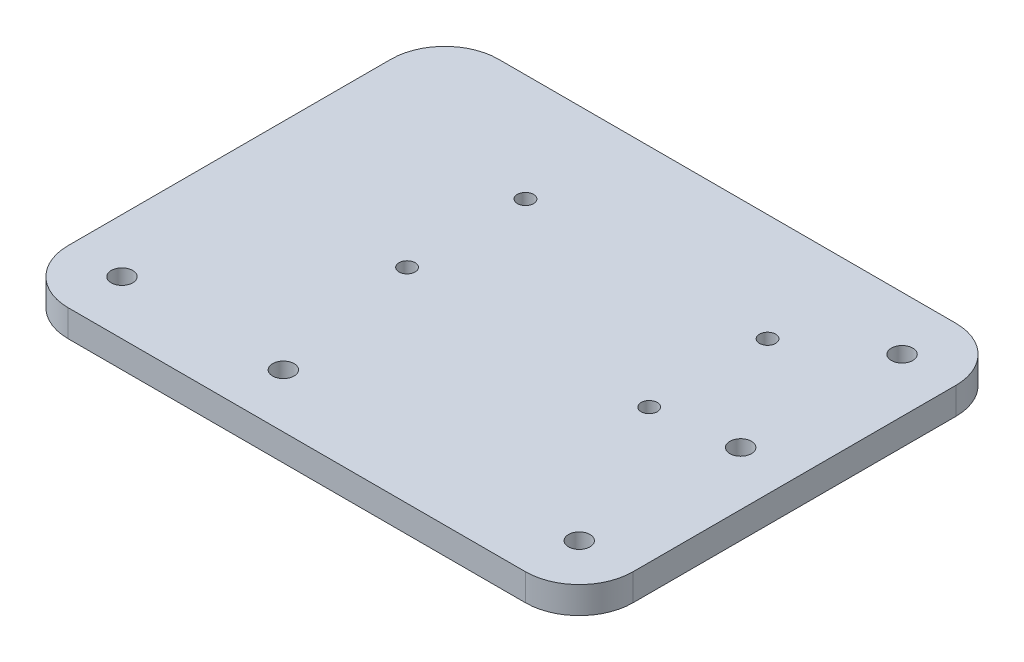
ISO-10303-21;
HEADER;
FILE_DESCRIPTION(('STEP AP214'),'2;1');
FILE_NAME('part.step','',(''),(''),'','','');
FILE_SCHEMA(('AUTOMOTIVE_DESIGN { 1 0 10303 214 1 1 1 1 }'));
ENDSEC;
DATA;
#1=APPLICATION_CONTEXT('core data for automotive mechanical design processes');
#2=APPLICATION_PROTOCOL_DEFINITION('international standard','automotive_design',2000,#1);
#3=PRODUCT_CONTEXT('',#1,'mechanical');
#4=PRODUCT('Part','Part','',(#3));
#5=PRODUCT_RELATED_PRODUCT_CATEGORY('part','',(#4));
#6=PRODUCT_DEFINITION_FORMATION('','',#4);
#7=PRODUCT_DEFINITION_CONTEXT('part definition',#1,'design');
#8=PRODUCT_DEFINITION('design','',#6,#7);
#9=PRODUCT_DEFINITION_SHAPE('','',#8);
#10=(LENGTH_UNIT() NAMED_UNIT(*) SI_UNIT(.MILLI.,.METRE.));
#11=(NAMED_UNIT(*) PLANE_ANGLE_UNIT() SI_UNIT($,.RADIAN.));
#12=(NAMED_UNIT(*) SI_UNIT($,.STERADIAN.) SOLID_ANGLE_UNIT());
#13=UNCERTAINTY_MEASURE_WITH_UNIT(LENGTH_MEASURE(1.E-05),#10,'distance_accuracy_value','');
#14=(GEOMETRIC_REPRESENTATION_CONTEXT(3) GLOBAL_UNCERTAINTY_ASSIGNED_CONTEXT((#13)) GLOBAL_UNIT_ASSIGNED_CONTEXT((#10,
#11,#12)) REPRESENTATION_CONTEXT('',''));
#15=CARTESIAN_POINT('',(0.,0.,0.));
#16=DIRECTION('',(0.,0.,1.));
#17=DIRECTION('',(1.,0.,0.));
#18=AXIS2_PLACEMENT_3D('',#15,#16,#17);
#19=CARTESIAN_POINT('',(-52.5,5.,40.));
#20=DIRECTION('',(1.,0.,0.));
#21=DIRECTION('',(0.,0.,-1.));
#22=AXIS2_PLACEMENT_3D('',#19,#20,#21);
#23=PLANE('',#22);
#24=DIRECTION('',(0.,0.,1.));
#25=VECTOR('',#24,1.);
#26=CARTESIAN_POINT('',(-52.5,0.,40.));
#27=LINE('',#26,#25);
#28=CARTESIAN_POINT('',(-52.5,0.,-30.));
#29=VERTEX_POINT('',#28);
#30=CARTESIAN_POINT('',(-52.5,0.,30.));
#31=VERTEX_POINT('',#30);
#32=EDGE_CURVE('E136',#29,#31,#27,.T.);
#33=ORIENTED_EDGE('',*,*,#32,.T.);
#34=DIRECTION('',(0.,-1.,0.));
#35=VECTOR('',#34,1.);
#36=CARTESIAN_POINT('',(-52.5,5.,30.));
#37=LINE('',#36,#35);
#38=CARTESIAN_POINT('',(-52.5,5.,30.));
#39=VERTEX_POINT('',#38);
#40=EDGE_CURVE('E111',#31,#39,#37,.F.);
#41=ORIENTED_EDGE('',*,*,#40,.T.);
#42=DIRECTION('',(0.,0.,1.));
#43=VECTOR('',#42,1.);
#44=CARTESIAN_POINT('',(-52.5,5.,40.));
#45=LINE('',#44,#43);
#46=CARTESIAN_POINT('',(-52.5,5.,-30.));
#47=VERTEX_POINT('',#46);
#48=EDGE_CURVE('E149',#47,#39,#45,.T.);
#49=ORIENTED_EDGE('',*,*,#48,.F.);
#50=DIRECTION('',(0.,-1.,0.));
#51=VECTOR('',#50,1.);
#52=CARTESIAN_POINT('',(-52.5,5.,-30.));
#53=LINE('',#52,#51);
#54=EDGE_CURVE('E117',#47,#29,#53,.T.);
#55=ORIENTED_EDGE('',*,*,#54,.T.);
#56=EDGE_LOOP('',(#33,#41,#49,#55));
#57=FACE_BOUND('',#56,.T.);
#58=ADVANCED_FACE('F39',(#57),#23,.F.);
#59=CARTESIAN_POINT('',(52.5,5.,40.));
#60=DIRECTION('',(0.,0.,-1.));
#61=DIRECTION('',(-1.,0.,0.));
#62=AXIS2_PLACEMENT_3D('',#59,#60,#61);
#63=PLANE('',#62);
#64=DIRECTION('',(1.,0.,0.));
#65=VECTOR('',#64,1.);
#66=CARTESIAN_POINT('',(52.5,5.,40.));
#67=LINE('',#66,#65);
#68=CARTESIAN_POINT('',(-42.5,5.,40.));
#69=VERTEX_POINT('',#68);
#70=CARTESIAN_POINT('',(42.5,5.,40.));
#71=VERTEX_POINT('',#70);
#72=EDGE_CURVE('E127',#69,#71,#67,.T.);
#73=ORIENTED_EDGE('',*,*,#72,.F.);
#74=DIRECTION('',(0.,-1.,0.));
#75=VECTOR('',#74,1.);
#76=CARTESIAN_POINT('',(-42.5,5.,40.));
#77=LINE('',#76,#75);
#78=CARTESIAN_POINT('',(-42.5,0.,40.));
#79=VERTEX_POINT('',#78);
#80=EDGE_CURVE('E110',#69,#79,#77,.T.);
#81=ORIENTED_EDGE('',*,*,#80,.T.);
#82=DIRECTION('',(1.,0.,0.));
#83=VECTOR('',#82,1.);
#84=CARTESIAN_POINT('',(52.5,0.,40.));
#85=LINE('',#84,#83);
#86=CARTESIAN_POINT('',(42.5,0.,40.));
#87=VERTEX_POINT('',#86);
#88=EDGE_CURVE('E124',#79,#87,#85,.T.);
#89=ORIENTED_EDGE('',*,*,#88,.T.);
#90=DIRECTION('',(0.,-1.,0.));
#91=VECTOR('',#90,1.);
#92=CARTESIAN_POINT('',(42.5,5.,40.));
#93=LINE('',#92,#91);
#94=EDGE_CURVE('E130',#87,#71,#93,.F.);
#95=ORIENTED_EDGE('',*,*,#94,.T.);
#96=EDGE_LOOP('',(#73,#81,#89,#95));
#97=FACE_BOUND('',#96,.T.);
#98=ADVANCED_FACE('F123',(#97),#63,.F.);
#99=CARTESIAN_POINT('',(52.5,5.,40.));
#100=DIRECTION('',(-1.,0.,0.));
#101=DIRECTION('',(0.,0.,1.));
#102=AXIS2_PLACEMENT_3D('',#99,#100,#101);
#103=PLANE('',#102);
#104=DIRECTION('',(0.,0.,-1.));
#105=VECTOR('',#104,1.);
#106=CARTESIAN_POINT('',(52.5,0.,40.));
#107=LINE('',#106,#105);
#108=CARTESIAN_POINT('',(52.5,0.,30.));
#109=VERTEX_POINT('',#108);
#110=CARTESIAN_POINT('',(52.5,0.,-30.));
#111=VERTEX_POINT('',#110);
#112=EDGE_CURVE('E135',#109,#111,#107,.T.);
#113=ORIENTED_EDGE('',*,*,#112,.T.);
#114=DIRECTION('',(0.,-1.,0.));
#115=VECTOR('',#114,1.);
#116=CARTESIAN_POINT('',(52.5,5.,-30.));
#117=LINE('',#116,#115);
#118=CARTESIAN_POINT('',(52.5,5.,-30.));
#119=VERTEX_POINT('',#118);
#120=EDGE_CURVE('E11',#111,#119,#117,.F.);
#121=ORIENTED_EDGE('',*,*,#120,.T.);
#122=DIRECTION('',(0.,0.,-1.));
#123=VECTOR('',#122,1.);
#124=CARTESIAN_POINT('',(52.5,5.,40.));
#125=LINE('',#124,#123);
#126=CARTESIAN_POINT('',(52.5,5.,30.));
#127=VERTEX_POINT('',#126);
#128=EDGE_CURVE('E188',#127,#119,#125,.T.);
#129=ORIENTED_EDGE('',*,*,#128,.F.);
#130=DIRECTION('',(0.,-1.,0.));
#131=VECTOR('',#130,1.);
#132=CARTESIAN_POINT('',(52.5,5.,30.));
#133=LINE('',#132,#131);
#134=EDGE_CURVE('E48',#127,#109,#133,.T.);
#135=ORIENTED_EDGE('',*,*,#134,.T.);
#136=EDGE_LOOP('',(#113,#121,#129,#135));
#137=FACE_BOUND('',#136,.T.);
#138=ADVANCED_FACE('F186',(#137),#103,.F.);
#139=CARTESIAN_POINT('',(52.5,5.,-40.));
#140=DIRECTION('',(0.,0.,1.));
#141=DIRECTION('',(1.,0.,0.));
#142=AXIS2_PLACEMENT_3D('',#139,#140,#141);
#143=PLANE('',#142);
#144=DIRECTION('',(-1.,0.,0.));
#145=VECTOR('',#144,1.);
#146=CARTESIAN_POINT('',(52.5,0.,-40.));
#147=LINE('',#146,#145);
#148=CARTESIAN_POINT('',(42.5,0.,-40.));
#149=VERTEX_POINT('',#148);
#150=CARTESIAN_POINT('',(-42.5,0.,-40.));
#151=VERTEX_POINT('',#150);
#152=EDGE_CURVE('E141',#149,#151,#147,.T.);
#153=ORIENTED_EDGE('',*,*,#152,.T.);
#154=DIRECTION('',(0.,-1.,0.));
#155=VECTOR('',#154,1.);
#156=CARTESIAN_POINT('',(-42.5,5.,-40.));
#157=LINE('',#156,#155);
#158=CARTESIAN_POINT('',(-42.5,5.,-40.));
#159=VERTEX_POINT('',#158);
#160=EDGE_CURVE('E55',#151,#159,#157,.F.);
#161=ORIENTED_EDGE('',*,*,#160,.T.);
#162=DIRECTION('',(-1.,0.,0.));
#163=VECTOR('',#162,1.);
#164=CARTESIAN_POINT('',(52.5,5.,-40.));
#165=LINE('',#164,#163);
#166=CARTESIAN_POINT('',(42.5,5.,-40.));
#167=VERTEX_POINT('',#166);
#168=EDGE_CURVE('E151',#167,#159,#165,.T.);
#169=ORIENTED_EDGE('',*,*,#168,.F.);
#170=DIRECTION('',(0.,-1.,0.));
#171=VECTOR('',#170,1.);
#172=CARTESIAN_POINT('',(42.5,5.,-40.));
#173=LINE('',#172,#171);
#174=EDGE_CURVE('E176',#167,#149,#173,.T.);
#175=ORIENTED_EDGE('',*,*,#174,.T.);
#176=EDGE_LOOP('',(#153,#161,#169,#175));
#177=FACE_BOUND('',#176,.T.);
#178=ADVANCED_FACE('F195',(#177),#143,.F.);
#179=CARTESIAN_POINT('',(0.,5.,0.));
#180=DIRECTION('',(0.,1.,0.));
#181=DIRECTION('',(0.,0.,1.));
#182=AXIS2_PLACEMENT_3D('',#179,#180,#181);
#183=PLANE('',#182);
#184=CARTESIAN_POINT('',(42.5,5.,30.));
#185=DIRECTION('',(0.,1.,0.));
#186=DIRECTION('',(0.,0.,1.));
#187=AXIS2_PLACEMENT_3D('',#184,#185,#186);
#188=CIRCLE('',#187,2.);
#189=CARTESIAN_POINT('',(42.5,5.,32.));
#190=VERTEX_POINT('',#189);
#191=EDGE_CURVE('E262',#190,#190,#188,.T.);
#192=ORIENTED_EDGE('',*,*,#191,.F.);
#193=EDGE_LOOP('',(#192));
#194=FACE_BOUND('',#193,.T.);
#195=CARTESIAN_POINT('',(42.5,5.,-30.));
#196=DIRECTION('',(0.,1.,0.));
#197=DIRECTION('',(0.,0.,1.));
#198=AXIS2_PLACEMENT_3D('',#195,#196,#197);
#199=CIRCLE('',#198,2.);
#200=CARTESIAN_POINT('',(42.5,5.,-28.));
#201=VERTEX_POINT('',#200);
#202=EDGE_CURVE('E270',#201,#201,#199,.T.);
#203=ORIENTED_EDGE('',*,*,#202,.F.);
#204=EDGE_LOOP('',(#203));
#205=FACE_BOUND('',#204,.T.);
#206=CARTESIAN_POINT('',(42.5,5.,0.));
#207=DIRECTION('',(0.,1.,0.));
#208=DIRECTION('',(0.,0.,1.));
#209=AXIS2_PLACEMENT_3D('',#206,#207,#208);
#210=CIRCLE('',#209,2.);
#211=CARTESIAN_POINT('',(42.5,5.,2.00000000000002));
#212=VERTEX_POINT('',#211);
#213=EDGE_CURVE('E246',#212,#212,#210,.T.);
#214=ORIENTED_EDGE('',*,*,#213,.F.);
#215=EDGE_LOOP('',(#214));
#216=FACE_BOUND('',#215,.T.);
#217=CARTESIAN_POINT('',(-42.5,5.,30.));
#218=DIRECTION('',(0.,1.,0.));
#219=DIRECTION('',(0.,0.,1.));
#220=AXIS2_PLACEMENT_3D('',#217,#218,#219);
#221=CIRCLE('',#220,2.);
#222=CARTESIAN_POINT('',(-42.5,5.,32.));
#223=VERTEX_POINT('',#222);
#224=EDGE_CURVE('E255',#223,#223,#221,.T.);
#225=ORIENTED_EDGE('',*,*,#224,.F.);
#226=EDGE_LOOP('',(#225));
#227=FACE_BOUND('',#226,.T.);
#228=CARTESIAN_POINT('',(-12.5,5.,30.));
#229=DIRECTION('',(0.,1.,0.));
#230=DIRECTION('',(0.,0.,1.));
#231=AXIS2_PLACEMENT_3D('',#228,#229,#230);
#232=CIRCLE('',#231,2.);
#233=CARTESIAN_POINT('',(-12.5,5.,32.));
#234=VERTEX_POINT('',#233);
#235=EDGE_CURVE('E238',#234,#234,#232,.T.);
#236=ORIENTED_EDGE('',*,*,#235,.F.);
#237=EDGE_LOOP('',(#236));
#238=FACE_BOUND('',#237,.T.);
#239=CARTESIAN_POINT('',(27.5,5.,-20.));
#240=DIRECTION('',(0.,1.,0.));
#241=DIRECTION('',(0.,0.,1.));
#242=AXIS2_PLACEMENT_3D('',#239,#240,#241);
#243=CIRCLE('',#242,1.5);
#244=CARTESIAN_POINT('',(27.5,5.,-18.5));
#245=VERTEX_POINT('',#244);
#246=EDGE_CURVE('E231',#245,#245,#243,.T.);
#247=ORIENTED_EDGE('',*,*,#246,.F.);
#248=EDGE_LOOP('',(#247));
#249=FACE_BOUND('',#248,.T.);
#250=CARTESIAN_POINT('',(27.5,5.,2.00000000000002));
#251=DIRECTION('',(0.,1.,0.));
#252=DIRECTION('',(0.,0.,1.));
#253=AXIS2_PLACEMENT_3D('',#250,#251,#252);
#254=CIRCLE('',#253,1.5);
#255=CARTESIAN_POINT('',(27.5,5.,3.50000000000003));
#256=VERTEX_POINT('',#255);
#257=EDGE_CURVE('E223',#256,#256,#254,.T.);
#258=ORIENTED_EDGE('',*,*,#257,.F.);
#259=EDGE_LOOP('',(#258));
#260=FACE_BOUND('',#259,.T.);
#261=CARTESIAN_POINT('',(-17.5,5.,2.00000000000002));
#262=DIRECTION('',(0.,1.,0.));
#263=DIRECTION('',(0.,0.,1.));
#264=AXIS2_PLACEMENT_3D('',#261,#262,#263);
#265=CIRCLE('',#264,1.5);
#266=CARTESIAN_POINT('',(-17.5,5.,3.50000000000002));
#267=VERTEX_POINT('',#266);
#268=EDGE_CURVE('E214',#267,#267,#265,.T.);
#269=ORIENTED_EDGE('',*,*,#268,.F.);
#270=EDGE_LOOP('',(#269));
#271=FACE_BOUND('',#270,.T.);
#272=CARTESIAN_POINT('',(-17.5,5.,-20.));
#273=DIRECTION('',(0.,1.,0.));
#274=DIRECTION('',(0.,0.,1.));
#275=AXIS2_PLACEMENT_3D('',#272,#273,#274);
#276=CIRCLE('',#275,1.5);
#277=CARTESIAN_POINT('',(-17.5,5.,-18.5));
#278=VERTEX_POINT('',#277);
#279=EDGE_CURVE('E206',#278,#278,#276,.T.);
#280=ORIENTED_EDGE('',*,*,#279,.F.);
#281=EDGE_LOOP('',(#280));
#282=FACE_BOUND('',#281,.T.);
#283=ORIENTED_EDGE('',*,*,#48,.T.);
#284=CARTESIAN_POINT('',(-42.5,5.,30.));
#285=DIRECTION('',(0.,1.,0.));
#286=DIRECTION('',(0.,0.,1.));
#287=AXIS2_PLACEMENT_3D('',#284,#285,#286);
#288=CIRCLE('',#287,10.);
#289=EDGE_CURVE('E173',#39,#69,#288,.T.);
#290=ORIENTED_EDGE('',*,*,#289,.T.);
#291=ORIENTED_EDGE('',*,*,#72,.T.);
#292=CARTESIAN_POINT('',(42.5,5.,30.));
#293=DIRECTION('',(0.,1.,0.));
#294=DIRECTION('',(0.,0.,1.));
#295=AXIS2_PLACEMENT_3D('',#292,#293,#294);
#296=CIRCLE('',#295,10.);
#297=EDGE_CURVE('E165',#71,#127,#296,.T.);
#298=ORIENTED_EDGE('',*,*,#297,.T.);
#299=ORIENTED_EDGE('',*,*,#128,.T.);
#300=CARTESIAN_POINT('',(42.5,5.,-30.));
#301=DIRECTION('',(0.,1.,0.));
#302=DIRECTION('',(0.,0.,1.));
#303=AXIS2_PLACEMENT_3D('',#300,#301,#302);
#304=CIRCLE('',#303,10.);
#305=EDGE_CURVE('E62',#119,#167,#304,.T.);
#306=ORIENTED_EDGE('',*,*,#305,.T.);
#307=ORIENTED_EDGE('',*,*,#168,.T.);
#308=CARTESIAN_POINT('',(-42.5,5.,-30.));
#309=DIRECTION('',(0.,1.,0.));
#310=DIRECTION('',(0.,0.,1.));
#311=AXIS2_PLACEMENT_3D('',#308,#309,#310);
#312=CIRCLE('',#311,10.);
#313=EDGE_CURVE('E170',#159,#47,#312,.T.);
#314=ORIENTED_EDGE('',*,*,#313,.T.);
#315=EDGE_LOOP('',(#283,#290,#291,#298,#299,#306,#307,#314));
#316=FACE_BOUND('',#315,.T.);
#317=ADVANCED_FACE('F288',(#194,#205,#216,#227,#238,#249,#260,#271,#282,#316),#183,.T.);
#318=CARTESIAN_POINT('',(0.,0.,0.));
#319=DIRECTION('',(0.,1.,0.));
#320=DIRECTION('',(0.,0.,1.));
#321=AXIS2_PLACEMENT_3D('',#318,#319,#320);
#322=PLANE('',#321);
#323=CARTESIAN_POINT('',(42.5,0.,30.));
#324=DIRECTION('',(0.,1.,0.));
#325=DIRECTION('',(0.,0.,1.));
#326=AXIS2_PLACEMENT_3D('',#323,#324,#325);
#327=CIRCLE('',#326,2.);
#328=CARTESIAN_POINT('',(42.5,0.,32.));
#329=VERTEX_POINT('',#328);
#330=EDGE_CURVE('E266',#329,#329,#327,.T.);
#331=ORIENTED_EDGE('',*,*,#330,.T.);
#332=EDGE_LOOP('',(#331));
#333=FACE_BOUND('',#332,.T.);
#334=CARTESIAN_POINT('',(42.5,0.,-30.));
#335=DIRECTION('',(0.,1.,0.));
#336=DIRECTION('',(0.,0.,1.));
#337=AXIS2_PLACEMENT_3D('',#334,#335,#336);
#338=CIRCLE('',#337,2.);
#339=CARTESIAN_POINT('',(42.5,0.,-28.));
#340=VERTEX_POINT('',#339);
#341=EDGE_CURVE('E251',#340,#340,#338,.T.);
#342=ORIENTED_EDGE('',*,*,#341,.T.);
#343=EDGE_LOOP('',(#342));
#344=FACE_BOUND('',#343,.T.);
#345=CARTESIAN_POINT('',(42.5,0.,0.));
#346=DIRECTION('',(0.,1.,0.));
#347=DIRECTION('',(0.,0.,1.));
#348=AXIS2_PLACEMENT_3D('',#345,#346,#347);
#349=CIRCLE('',#348,2.);
#350=CARTESIAN_POINT('',(42.5,0.,2.00000000000002));
#351=VERTEX_POINT('',#350);
#352=EDGE_CURVE('E250',#351,#351,#349,.T.);
#353=ORIENTED_EDGE('',*,*,#352,.T.);
#354=EDGE_LOOP('',(#353));
#355=FACE_BOUND('',#354,.T.);
#356=CARTESIAN_POINT('',(-42.5,0.,30.));
#357=DIRECTION('',(0.,1.,0.));
#358=DIRECTION('',(0.,0.,1.));
#359=AXIS2_PLACEMENT_3D('',#356,#357,#358);
#360=CIRCLE('',#359,2.);
#361=CARTESIAN_POINT('',(-42.5,0.,32.));
#362=VERTEX_POINT('',#361);
#363=EDGE_CURVE('E242',#362,#362,#360,.T.);
#364=ORIENTED_EDGE('',*,*,#363,.T.);
#365=EDGE_LOOP('',(#364));
#366=FACE_BOUND('',#365,.T.);
#367=CARTESIAN_POINT('',(-12.5,0.,30.));
#368=DIRECTION('',(0.,1.,0.));
#369=DIRECTION('',(0.,0.,1.));
#370=AXIS2_PLACEMENT_3D('',#367,#368,#369);
#371=CIRCLE('',#370,2.);
#372=CARTESIAN_POINT('',(-12.5,0.,32.));
#373=VERTEX_POINT('',#372);
#374=EDGE_CURVE('E219',#373,#373,#371,.T.);
#375=ORIENTED_EDGE('',*,*,#374,.T.);
#376=EDGE_LOOP('',(#375));
#377=FACE_BOUND('',#376,.T.);
#378=CARTESIAN_POINT('',(27.5,0.,-20.));
#379=DIRECTION('',(0.,1.,0.));
#380=DIRECTION('',(0.,0.,1.));
#381=AXIS2_PLACEMENT_3D('',#378,#379,#380);
#382=CIRCLE('',#381,1.5);
#383=CARTESIAN_POINT('',(27.5,0.,-18.5));
#384=VERTEX_POINT('',#383);
#385=EDGE_CURVE('E210',#384,#384,#382,.T.);
#386=ORIENTED_EDGE('',*,*,#385,.T.);
#387=EDGE_LOOP('',(#386));
#388=FACE_BOUND('',#387,.T.);
#389=CARTESIAN_POINT('',(27.5,0.,2.00000000000002));
#390=DIRECTION('',(0.,1.,0.));
#391=DIRECTION('',(0.,0.,1.));
#392=AXIS2_PLACEMENT_3D('',#389,#390,#391);
#393=CIRCLE('',#392,1.5);
#394=CARTESIAN_POINT('',(27.5,0.,3.50000000000003));
#395=VERTEX_POINT('',#394);
#396=EDGE_CURVE('E227',#395,#395,#393,.T.);
#397=ORIENTED_EDGE('',*,*,#396,.T.);
#398=EDGE_LOOP('',(#397));
#399=FACE_BOUND('',#398,.T.);
#400=CARTESIAN_POINT('',(-17.5,0.,2.00000000000002));
#401=DIRECTION('',(0.,1.,0.));
#402=DIRECTION('',(0.,0.,1.));
#403=AXIS2_PLACEMENT_3D('',#400,#401,#402);
#404=CIRCLE('',#403,1.5);
#405=CARTESIAN_POINT('',(-17.5,0.,3.50000000000002));
#406=VERTEX_POINT('',#405);
#407=EDGE_CURVE('E218',#406,#406,#404,.T.);
#408=ORIENTED_EDGE('',*,*,#407,.T.);
#409=EDGE_LOOP('',(#408));
#410=FACE_BOUND('',#409,.T.);
#411=CARTESIAN_POINT('',(-17.5,0.,-20.));
#412=DIRECTION('',(0.,1.,0.));
#413=DIRECTION('',(0.,0.,1.));
#414=AXIS2_PLACEMENT_3D('',#411,#412,#413);
#415=CIRCLE('',#414,1.5);
#416=CARTESIAN_POINT('',(-17.5,0.,-18.5));
#417=VERTEX_POINT('',#416);
#418=EDGE_CURVE('E143',#417,#417,#415,.T.);
#419=ORIENTED_EDGE('',*,*,#418,.T.);
#420=EDGE_LOOP('',(#419));
#421=FACE_BOUND('',#420,.T.);
#422=ORIENTED_EDGE('',*,*,#88,.F.);
#423=CARTESIAN_POINT('',(-42.5,0.,30.));
#424=DIRECTION('',(0.,1.,0.));
#425=DIRECTION('',(0.,0.,1.));
#426=AXIS2_PLACEMENT_3D('',#423,#424,#425);
#427=CIRCLE('',#426,10.);
#428=EDGE_CURVE('E106',#79,#31,#427,.F.);
#429=ORIENTED_EDGE('',*,*,#428,.T.);
#430=ORIENTED_EDGE('',*,*,#32,.F.);
#431=CARTESIAN_POINT('',(-42.5,0.,-30.));
#432=DIRECTION('',(0.,1.,0.));
#433=DIRECTION('',(0.,0.,1.));
#434=AXIS2_PLACEMENT_3D('',#431,#432,#433);
#435=CIRCLE('',#434,10.);
#436=EDGE_CURVE('E118',#29,#151,#435,.F.);
#437=ORIENTED_EDGE('',*,*,#436,.T.);
#438=ORIENTED_EDGE('',*,*,#152,.F.);
#439=CARTESIAN_POINT('',(42.5,0.,-30.));
#440=DIRECTION('',(0.,1.,0.));
#441=DIRECTION('',(0.,0.,1.));
#442=AXIS2_PLACEMENT_3D('',#439,#440,#441);
#443=CIRCLE('',#442,10.);
#444=EDGE_CURVE('E155',#149,#111,#443,.F.);
#445=ORIENTED_EDGE('',*,*,#444,.T.);
#446=ORIENTED_EDGE('',*,*,#112,.F.);
#447=CARTESIAN_POINT('',(42.5,0.,30.));
#448=DIRECTION('',(0.,1.,0.));
#449=DIRECTION('',(0.,0.,1.));
#450=AXIS2_PLACEMENT_3D('',#447,#448,#449);
#451=CIRCLE('',#450,10.);
#452=EDGE_CURVE('E129',#109,#87,#451,.F.);
#453=ORIENTED_EDGE('',*,*,#452,.T.);
#454=EDGE_LOOP('',(#422,#429,#430,#437,#438,#445,#446,#453));
#455=FACE_BOUND('',#454,.T.);
#456=ADVANCED_FACE('F132',(#333,#344,#355,#366,#377,#388,#399,#410,#421,#455),#322,.F.);
#457=CARTESIAN_POINT('',(-17.5,0.,-20.));
#458=DIRECTION('',(0.,1.,0.));
#459=DIRECTION('',(0.,0.,1.));
#460=AXIS2_PLACEMENT_3D('',#457,#458,#459);
#461=CYLINDRICAL_SURFACE('',#460,1.5);
#462=ORIENTED_EDGE('',*,*,#418,.F.);
#463=EDGE_LOOP('',(#462));
#464=FACE_BOUND('',#463,.T.);
#465=ORIENTED_EDGE('',*,*,#279,.T.);
#466=EDGE_LOOP('',(#465));
#467=FACE_BOUND('',#466,.T.);
#468=ADVANCED_FACE('F330',(#464,#467),#461,.F.);
#469=CARTESIAN_POINT('',(-17.5,0.,2.00000000000002));
#470=DIRECTION('',(0.,1.,0.));
#471=DIRECTION('',(0.,0.,1.));
#472=AXIS2_PLACEMENT_3D('',#469,#470,#471);
#473=CYLINDRICAL_SURFACE('',#472,1.5);
#474=ORIENTED_EDGE('',*,*,#407,.F.);
#475=EDGE_LOOP('',(#474));
#476=FACE_BOUND('',#475,.T.);
#477=ORIENTED_EDGE('',*,*,#268,.T.);
#478=EDGE_LOOP('',(#477));
#479=FACE_BOUND('',#478,.T.);
#480=ADVANCED_FACE('F335',(#476,#479),#473,.F.);
#481=CARTESIAN_POINT('',(27.5,0.,2.00000000000002));
#482=DIRECTION('',(0.,1.,0.));
#483=DIRECTION('',(0.,0.,1.));
#484=AXIS2_PLACEMENT_3D('',#481,#482,#483);
#485=CYLINDRICAL_SURFACE('',#484,1.5);
#486=ORIENTED_EDGE('',*,*,#396,.F.);
#487=EDGE_LOOP('',(#486));
#488=FACE_BOUND('',#487,.T.);
#489=ORIENTED_EDGE('',*,*,#257,.T.);
#490=EDGE_LOOP('',(#489));
#491=FACE_BOUND('',#490,.T.);
#492=ADVANCED_FACE('F339',(#488,#491),#485,.F.);
#493=CARTESIAN_POINT('',(27.5,0.,-20.));
#494=DIRECTION('',(0.,1.,0.));
#495=DIRECTION('',(0.,0.,1.));
#496=AXIS2_PLACEMENT_3D('',#493,#494,#495);
#497=CYLINDRICAL_SURFACE('',#496,1.5);
#498=ORIENTED_EDGE('',*,*,#385,.F.);
#499=EDGE_LOOP('',(#498));
#500=FACE_BOUND('',#499,.T.);
#501=ORIENTED_EDGE('',*,*,#246,.T.);
#502=EDGE_LOOP('',(#501));
#503=FACE_BOUND('',#502,.T.);
#504=ADVANCED_FACE('F343',(#500,#503),#497,.F.);
#505=CARTESIAN_POINT('',(-12.5,0.,30.));
#506=DIRECTION('',(0.,1.,0.));
#507=DIRECTION('',(0.,0.,1.));
#508=AXIS2_PLACEMENT_3D('',#505,#506,#507);
#509=CYLINDRICAL_SURFACE('',#508,2.);
#510=ORIENTED_EDGE('',*,*,#374,.F.);
#511=EDGE_LOOP('',(#510));
#512=FACE_BOUND('',#511,.T.);
#513=ORIENTED_EDGE('',*,*,#235,.T.);
#514=EDGE_LOOP('',(#513));
#515=FACE_BOUND('',#514,.T.);
#516=ADVANCED_FACE('F347',(#512,#515),#509,.F.);
#517=CARTESIAN_POINT('',(-42.5,0.,30.));
#518=DIRECTION('',(0.,1.,0.));
#519=DIRECTION('',(0.,0.,1.));
#520=AXIS2_PLACEMENT_3D('',#517,#518,#519);
#521=CYLINDRICAL_SURFACE('',#520,2.);
#522=ORIENTED_EDGE('',*,*,#363,.F.);
#523=EDGE_LOOP('',(#522));
#524=FACE_BOUND('',#523,.T.);
#525=ORIENTED_EDGE('',*,*,#224,.T.);
#526=EDGE_LOOP('',(#525));
#527=FACE_BOUND('',#526,.T.);
#528=ADVANCED_FACE('F351',(#524,#527),#521,.F.);
#529=CARTESIAN_POINT('',(42.5,0.,0.));
#530=DIRECTION('',(0.,1.,0.));
#531=DIRECTION('',(0.,0.,1.));
#532=AXIS2_PLACEMENT_3D('',#529,#530,#531);
#533=CYLINDRICAL_SURFACE('',#532,2.);
#534=ORIENTED_EDGE('',*,*,#352,.F.);
#535=EDGE_LOOP('',(#534));
#536=FACE_BOUND('',#535,.T.);
#537=ORIENTED_EDGE('',*,*,#213,.T.);
#538=EDGE_LOOP('',(#537));
#539=FACE_BOUND('',#538,.T.);
#540=ADVANCED_FACE('F284',(#536,#539),#533,.F.);
#541=CARTESIAN_POINT('',(42.5,0.,-30.));
#542=DIRECTION('',(0.,1.,0.));
#543=DIRECTION('',(0.,0.,1.));
#544=AXIS2_PLACEMENT_3D('',#541,#542,#543);
#545=CYLINDRICAL_SURFACE('',#544,2.);
#546=ORIENTED_EDGE('',*,*,#341,.F.);
#547=EDGE_LOOP('',(#546));
#548=FACE_BOUND('',#547,.T.);
#549=ORIENTED_EDGE('',*,*,#202,.T.);
#550=EDGE_LOOP('',(#549));
#551=FACE_BOUND('',#550,.T.);
#552=ADVANCED_FACE('F280',(#548,#551),#545,.F.);
#553=CARTESIAN_POINT('',(42.5,0.,30.));
#554=DIRECTION('',(0.,1.,0.));
#555=DIRECTION('',(0.,0.,1.));
#556=AXIS2_PLACEMENT_3D('',#553,#554,#555);
#557=CYLINDRICAL_SURFACE('',#556,2.);
#558=ORIENTED_EDGE('',*,*,#330,.F.);
#559=EDGE_LOOP('',(#558));
#560=FACE_BOUND('',#559,.T.);
#561=ORIENTED_EDGE('',*,*,#191,.T.);
#562=EDGE_LOOP('',(#561));
#563=FACE_BOUND('',#562,.T.);
#564=ADVANCED_FACE('F283',(#560,#563),#557,.F.);
#565=CARTESIAN_POINT('',(-42.5,5.,30.));
#566=DIRECTION('',(0.,-1.,0.));
#567=DIRECTION('',(0.,0.,-1.));
#568=AXIS2_PLACEMENT_3D('',#565,#566,#567);
#569=CYLINDRICAL_SURFACE('',#568,10.);
#570=ORIENTED_EDGE('',*,*,#289,.F.);
#571=ORIENTED_EDGE('',*,*,#40,.F.);
#572=ORIENTED_EDGE('',*,*,#428,.F.);
#573=ORIENTED_EDGE('',*,*,#80,.F.);
#574=EDGE_LOOP('',(#570,#571,#572,#573));
#575=FACE_BOUND('',#574,.T.);
#576=ADVANCED_FACE('F109',(#575),#569,.T.);
#577=CARTESIAN_POINT('',(-42.5,5.,-30.));
#578=DIRECTION('',(0.,-1.,0.));
#579=DIRECTION('',(0.,0.,-1.));
#580=AXIS2_PLACEMENT_3D('',#577,#578,#579);
#581=CYLINDRICAL_SURFACE('',#580,10.);
#582=ORIENTED_EDGE('',*,*,#313,.F.);
#583=ORIENTED_EDGE('',*,*,#160,.F.);
#584=ORIENTED_EDGE('',*,*,#436,.F.);
#585=ORIENTED_EDGE('',*,*,#54,.F.);
#586=EDGE_LOOP('',(#582,#583,#584,#585));
#587=FACE_BOUND('',#586,.T.);
#588=ADVANCED_FACE('F310',(#587),#581,.T.);
#589=CARTESIAN_POINT('',(42.5,5.,-30.));
#590=DIRECTION('',(0.,-1.,0.));
#591=DIRECTION('',(0.,0.,-1.));
#592=AXIS2_PLACEMENT_3D('',#589,#590,#591);
#593=CYLINDRICAL_SURFACE('',#592,10.);
#594=ORIENTED_EDGE('',*,*,#305,.F.);
#595=ORIENTED_EDGE('',*,*,#120,.F.);
#596=ORIENTED_EDGE('',*,*,#444,.F.);
#597=ORIENTED_EDGE('',*,*,#174,.F.);
#598=EDGE_LOOP('',(#594,#595,#596,#597));
#599=FACE_BOUND('',#598,.T.);
#600=ADVANCED_FACE('F194',(#599),#593,.T.);
#601=CARTESIAN_POINT('',(42.5,5.,30.));
#602=DIRECTION('',(0.,-1.,0.));
#603=DIRECTION('',(0.,0.,-1.));
#604=AXIS2_PLACEMENT_3D('',#601,#602,#603);
#605=CYLINDRICAL_SURFACE('',#604,10.);
#606=ORIENTED_EDGE('',*,*,#297,.F.);
#607=ORIENTED_EDGE('',*,*,#94,.F.);
#608=ORIENTED_EDGE('',*,*,#452,.F.);
#609=ORIENTED_EDGE('',*,*,#134,.F.);
#610=EDGE_LOOP('',(#606,#607,#608,#609));
#611=FACE_BOUND('',#610,.T.);
#612=ADVANCED_FACE('F41',(#611),#605,.T.);
#613=CLOSED_SHELL('',(#58,#98,#138,#178,#317,#456,#468,#480,#492,#504,#516,#528,#540,#552,#564,
#576,#588,#600,#612));
#614=MANIFOLD_SOLID_BREP('B2',#613);
#615=ADVANCED_BREP_SHAPE_REPRESENTATION('',(#18,#614),#14);
#616=SHAPE_DEFINITION_REPRESENTATION(#9,#615);
ENDSEC;
END-ISO-10303-21;
